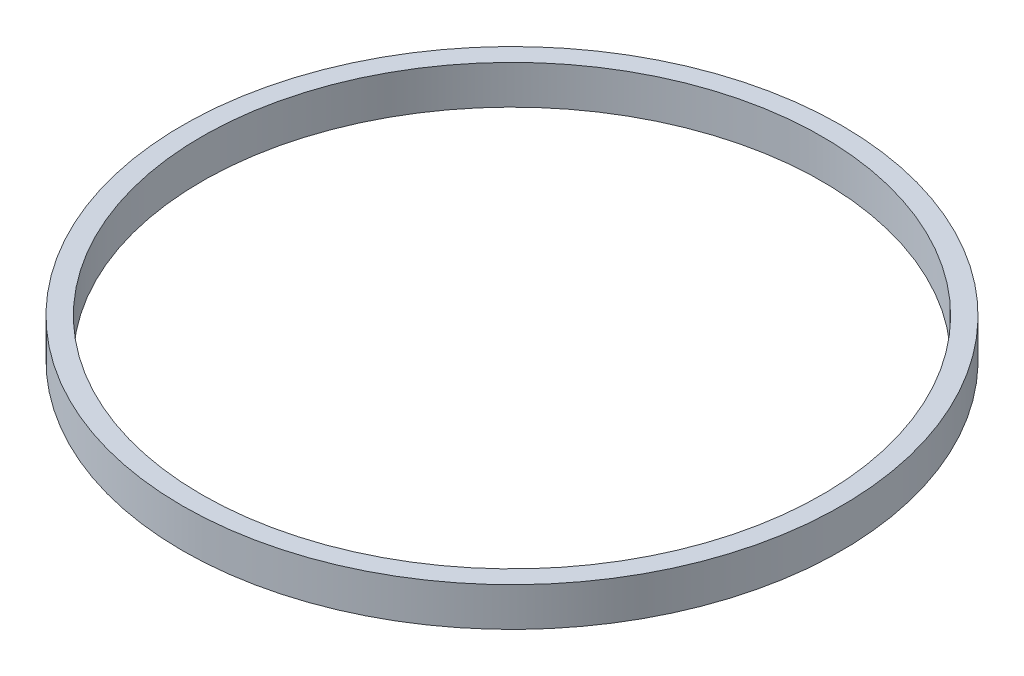
ISO-10303-21;
HEADER;
FILE_DESCRIPTION(('STEP AP214'),'2;1');
FILE_NAME('part.step','',(''),(''),'','','');
FILE_SCHEMA(('AUTOMOTIVE_DESIGN { 1 0 10303 214 1 1 1 1 }'));
ENDSEC;
DATA;
#1=APPLICATION_CONTEXT('core data for automotive mechanical design processes');
#2=APPLICATION_PROTOCOL_DEFINITION('international standard','automotive_design',2000,#1);
#3=PRODUCT_CONTEXT('',#1,'mechanical');
#4=PRODUCT('Part','Part','',(#3));
#5=PRODUCT_RELATED_PRODUCT_CATEGORY('part','',(#4));
#6=PRODUCT_DEFINITION_FORMATION('','',#4);
#7=PRODUCT_DEFINITION_CONTEXT('part definition',#1,'design');
#8=PRODUCT_DEFINITION('design','',#6,#7);
#9=PRODUCT_DEFINITION_SHAPE('','',#8);
#10=(LENGTH_UNIT() NAMED_UNIT(*) SI_UNIT(.MILLI.,.METRE.));
#11=(NAMED_UNIT(*) PLANE_ANGLE_UNIT() SI_UNIT($,.RADIAN.));
#12=(NAMED_UNIT(*) SI_UNIT($,.STERADIAN.) SOLID_ANGLE_UNIT());
#13=UNCERTAINTY_MEASURE_WITH_UNIT(LENGTH_MEASURE(1.E-05),#10,'distance_accuracy_value','');
#14=(GEOMETRIC_REPRESENTATION_CONTEXT(3) GLOBAL_UNCERTAINTY_ASSIGNED_CONTEXT((#13)) GLOBAL_UNIT_ASSIGNED_CONTEXT((#10,
#11,#12)) REPRESENTATION_CONTEXT('',''));
#15=CARTESIAN_POINT('',(0.,0.,0.));
#16=DIRECTION('',(0.,0.,1.));
#17=DIRECTION('',(1.,0.,0.));
#18=AXIS2_PLACEMENT_3D('',#15,#16,#17);
#19=CARTESIAN_POINT('',(0.,10.,0.));
#20=DIRECTION('',(0.,1.,0.));
#21=DIRECTION('',(0.,0.,1.));
#22=AXIS2_PLACEMENT_3D('',#19,#20,#21);
#23=PLANE('',#22);
#24=CARTESIAN_POINT('',(0.,10.,0.));
#25=DIRECTION('',(0.,1.,0.));
#26=DIRECTION('',(0.,0.,1.));
#27=AXIS2_PLACEMENT_3D('',#24,#25,#26);
#28=CIRCLE('',#27,85.);
#29=CARTESIAN_POINT('',(0.,10.,85.));
#30=VERTEX_POINT('',#29);
#31=EDGE_CURVE('E10',#30,#30,#28,.T.);
#32=ORIENTED_EDGE('',*,*,#31,.T.);
#33=EDGE_LOOP('',(#32));
#34=FACE_BOUND('',#33,.T.);
#35=CARTESIAN_POINT('',(0.,10.,0.));
#36=DIRECTION('',(0.,1.,0.));
#37=DIRECTION('',(0.,0.,1.));
#38=AXIS2_PLACEMENT_3D('',#35,#36,#37);
#39=CIRCLE('',#38,80.);
#40=CARTESIAN_POINT('',(0.,10.,80.));
#41=VERTEX_POINT('',#40);
#42=EDGE_CURVE('E42',#41,#41,#39,.T.);
#43=ORIENTED_EDGE('',*,*,#42,.F.);
#44=EDGE_LOOP('',(#43));
#45=FACE_BOUND('',#44,.T.);
#46=ADVANCED_FACE('F31',(#34,#45),#23,.T.);
#47=CARTESIAN_POINT('',(0.,0.,0.));
#48=DIRECTION('',(0.,1.,0.));
#49=DIRECTION('',(0.,0.,1.));
#50=AXIS2_PLACEMENT_3D('',#47,#48,#49);
#51=PLANE('',#50);
#52=CARTESIAN_POINT('',(0.,0.,0.));
#53=DIRECTION('',(0.,1.,0.));
#54=DIRECTION('',(0.,0.,1.));
#55=AXIS2_PLACEMENT_3D('',#52,#53,#54);
#56=CIRCLE('',#55,85.);
#57=CARTESIAN_POINT('',(0.,0.,85.));
#58=VERTEX_POINT('',#57);
#59=EDGE_CURVE('E35',#58,#58,#56,.T.);
#60=ORIENTED_EDGE('',*,*,#59,.F.);
#61=EDGE_LOOP('',(#60));
#62=FACE_BOUND('',#61,.T.);
#63=CARTESIAN_POINT('',(0.,0.,0.));
#64=DIRECTION('',(0.,1.,0.));
#65=DIRECTION('',(0.,0.,1.));
#66=AXIS2_PLACEMENT_3D('',#63,#64,#65);
#67=CIRCLE('',#66,80.);
#68=CARTESIAN_POINT('',(0.,0.,80.));
#69=VERTEX_POINT('',#68);
#70=EDGE_CURVE('E44',#69,#69,#67,.T.);
#71=ORIENTED_EDGE('',*,*,#70,.T.);
#72=EDGE_LOOP('',(#71));
#73=FACE_BOUND('',#72,.T.);
#74=ADVANCED_FACE('F54',(#62,#73),#51,.F.);
#75=CARTESIAN_POINT('',(0.,10.,0.));
#76=DIRECTION('',(0.,-1.,0.));
#77=DIRECTION('',(0.,0.,-1.));
#78=AXIS2_PLACEMENT_3D('',#75,#76,#77);
#79=CYLINDRICAL_SURFACE('',#78,85.);
#80=ORIENTED_EDGE('',*,*,#31,.F.);
#81=EDGE_LOOP('',(#80));
#82=FACE_BOUND('',#81,.T.);
#83=ORIENTED_EDGE('',*,*,#59,.T.);
#84=EDGE_LOOP('',(#83));
#85=FACE_BOUND('',#84,.T.);
#86=ADVANCED_FACE('F33',(#82,#85),#79,.T.);
#87=CARTESIAN_POINT('',(0.,10.,0.));
#88=DIRECTION('',(0.,-1.,0.));
#89=DIRECTION('',(0.,0.,-1.));
#90=AXIS2_PLACEMENT_3D('',#87,#88,#89);
#91=CYLINDRICAL_SURFACE('',#90,80.);
#92=ORIENTED_EDGE('',*,*,#42,.T.);
#93=EDGE_LOOP('',(#92));
#94=FACE_BOUND('',#93,.T.);
#95=ORIENTED_EDGE('',*,*,#70,.F.);
#96=EDGE_LOOP('',(#95));
#97=FACE_BOUND('',#96,.T.);
#98=ADVANCED_FACE('F50',(#94,#97),#91,.F.);
#99=CLOSED_SHELL('',(#46,#74,#86,#98));
#100=MANIFOLD_SOLID_BREP('B2',#99);
#101=ADVANCED_BREP_SHAPE_REPRESENTATION('',(#18,#100),#14);
#102=SHAPE_DEFINITION_REPRESENTATION(#9,#101);
ENDSEC;
END-ISO-10303-21;
